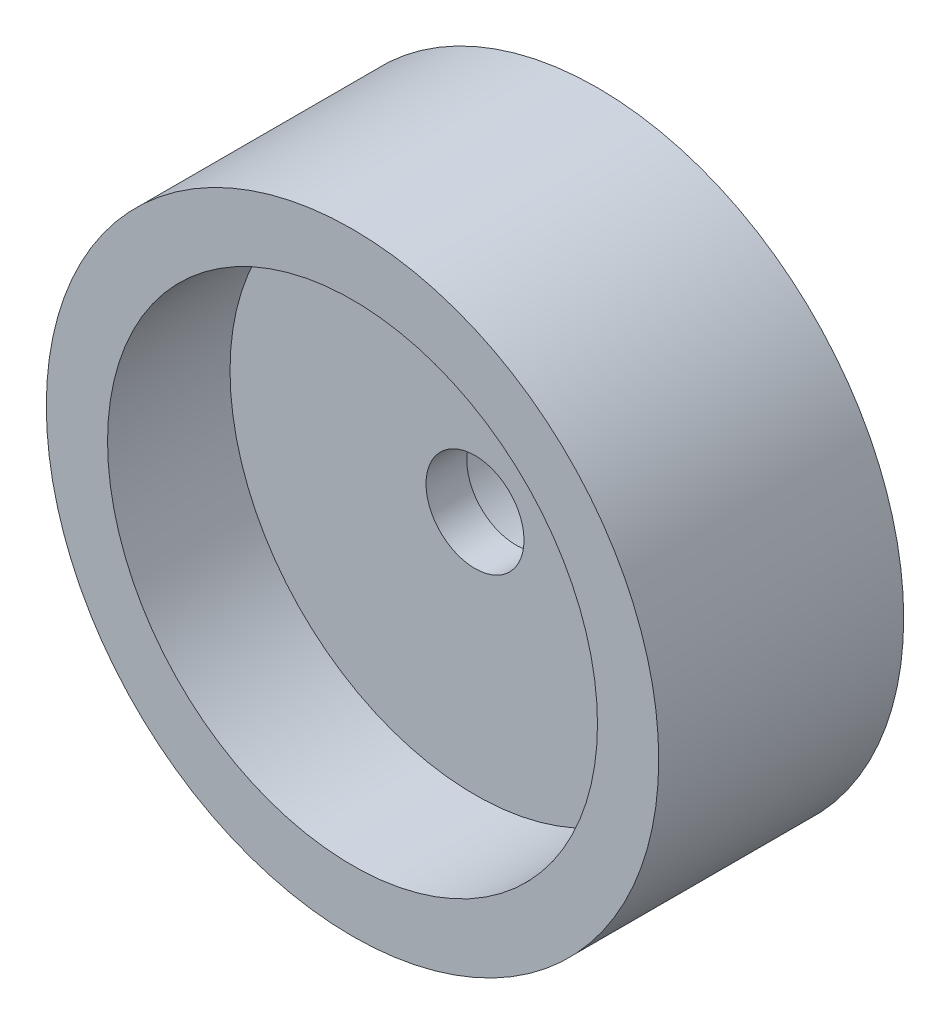
ISO-10303-21;
HEADER;
FILE_DESCRIPTION(('STEP AP214'),'2;1');
FILE_NAME('part.step','',(''),(''),'','','');
FILE_SCHEMA(('AUTOMOTIVE_DESIGN { 1 0 10303 214 1 1 1 1 }'));
ENDSEC;
DATA;
#1=APPLICATION_CONTEXT('core data for automotive mechanical design processes');
#2=APPLICATION_PROTOCOL_DEFINITION('international standard','automotive_design',2000,#1);
#3=PRODUCT_CONTEXT('',#1,'mechanical');
#4=PRODUCT('Part','Part','',(#3));
#5=PRODUCT_RELATED_PRODUCT_CATEGORY('part','',(#4));
#6=PRODUCT_DEFINITION_FORMATION('','',#4);
#7=PRODUCT_DEFINITION_CONTEXT('part definition',#1,'design');
#8=PRODUCT_DEFINITION('design','',#6,#7);
#9=PRODUCT_DEFINITION_SHAPE('','',#8);
#10=(LENGTH_UNIT() NAMED_UNIT(*) SI_UNIT(.MILLI.,.METRE.));
#11=(NAMED_UNIT(*) PLANE_ANGLE_UNIT() SI_UNIT($,.RADIAN.));
#12=(NAMED_UNIT(*) SI_UNIT($,.STERADIAN.) SOLID_ANGLE_UNIT());
#13=UNCERTAINTY_MEASURE_WITH_UNIT(LENGTH_MEASURE(1.E-05),#10,'distance_accuracy_value','');
#14=(GEOMETRIC_REPRESENTATION_CONTEXT(3) GLOBAL_UNCERTAINTY_ASSIGNED_CONTEXT((#13)) GLOBAL_UNIT_ASSIGNED_CONTEXT((#10,
#11,#12)) REPRESENTATION_CONTEXT('',''));
#15=CARTESIAN_POINT('',(0.,0.,0.));
#16=DIRECTION('',(0.,0.,1.));
#17=DIRECTION('',(1.,0.,0.));
#18=AXIS2_PLACEMENT_3D('',#15,#16,#17);
#19=CARTESIAN_POINT('',(0.,0.,6.));
#20=DIRECTION('',(0.,0.,-1.));
#21=DIRECTION('',(-1.,0.,0.));
#22=AXIS2_PLACEMENT_3D('',#19,#20,#21);
#23=CYLINDRICAL_SURFACE('',#22,7.5);
#24=CARTESIAN_POINT('',(0.,0.,6.));
#25=DIRECTION('',(0.,0.,1.));
#26=DIRECTION('',(1.,0.,0.));
#27=AXIS2_PLACEMENT_3D('',#24,#25,#26);
#28=CIRCLE('',#27,7.5);
#29=CARTESIAN_POINT('',(7.5,0.,6.));
#30=VERTEX_POINT('',#29);
#31=EDGE_CURVE('E10',#30,#30,#28,.T.);
#32=ORIENTED_EDGE('',*,*,#31,.F.);
#33=EDGE_LOOP('',(#32));
#34=FACE_BOUND('',#33,.T.);
#35=CARTESIAN_POINT('',(0.,0.,0.));
#36=DIRECTION('',(0.,0.,1.));
#37=DIRECTION('',(1.,0.,0.));
#38=AXIS2_PLACEMENT_3D('',#35,#36,#37);
#39=CIRCLE('',#38,7.5);
#40=CARTESIAN_POINT('',(7.5,0.,0.));
#41=VERTEX_POINT('',#40);
#42=EDGE_CURVE('E38',#41,#41,#39,.T.);
#43=ORIENTED_EDGE('',*,*,#42,.T.);
#44=EDGE_LOOP('',(#43));
#45=FACE_BOUND('',#44,.T.);
#46=ADVANCED_FACE('F31',(#34,#45),#23,.T.);
#47=CARTESIAN_POINT('',(0.,0.,6.));
#48=DIRECTION('',(0.,0.,1.));
#49=DIRECTION('',(1.,0.,0.));
#50=AXIS2_PLACEMENT_3D('',#47,#48,#49);
#51=PLANE('',#50);
#52=CARTESIAN_POINT('',(0.,0.,6.));
#53=DIRECTION('',(0.,0.,1.));
#54=DIRECTION('',(1.,0.,0.));
#55=AXIS2_PLACEMENT_3D('',#52,#53,#54);
#56=CIRCLE('',#55,6.);
#57=CARTESIAN_POINT('',(6.,0.,6.));
#58=VERTEX_POINT('',#57);
#59=EDGE_CURVE('E45',#58,#58,#56,.T.);
#60=ORIENTED_EDGE('',*,*,#59,.F.);
#61=EDGE_LOOP('',(#60));
#62=FACE_BOUND('',#61,.T.);
#63=ORIENTED_EDGE('',*,*,#31,.T.);
#64=EDGE_LOOP('',(#63));
#65=FACE_BOUND('',#64,.T.);
#66=ADVANCED_FACE('F69',(#62,#65),#51,.T.);
#67=CARTESIAN_POINT('',(0.,0.,0.));
#68=DIRECTION('',(0.,0.,1.));
#69=DIRECTION('',(1.,0.,0.));
#70=AXIS2_PLACEMENT_3D('',#67,#68,#69);
#71=PLANE('',#70);
#72=CARTESIAN_POINT('',(0.,0.,0.));
#73=DIRECTION('',(0.,0.,-1.));
#74=DIRECTION('',(-1.,0.,0.));
#75=AXIS2_PLACEMENT_3D('',#72,#73,#74);
#76=CIRCLE('',#75,2.275);
#77=CARTESIAN_POINT('',(-2.275,0.,0.));
#78=VERTEX_POINT('',#77);
#79=EDGE_CURVE('E59',#78,#78,#76,.T.);
#80=ORIENTED_EDGE('',*,*,#79,.F.);
#81=EDGE_LOOP('',(#80));
#82=FACE_BOUND('',#81,.T.);
#83=ORIENTED_EDGE('',*,*,#42,.F.);
#84=EDGE_LOOP('',(#83));
#85=FACE_BOUND('',#84,.T.);
#86=ADVANCED_FACE('F65',(#82,#85),#71,.F.);
#87=CARTESIAN_POINT('',(0.,0.,3.));
#88=DIRECTION('',(0.,0.,1.));
#89=DIRECTION('',(1.,0.,0.));
#90=AXIS2_PLACEMENT_3D('',#87,#88,#89);
#91=CYLINDRICAL_SURFACE('',#90,6.);
#92=CARTESIAN_POINT('',(0.,0.,3.));
#93=DIRECTION('',(0.,0.,1.));
#94=DIRECTION('',(1.,0.,0.));
#95=AXIS2_PLACEMENT_3D('',#92,#93,#94);
#96=CIRCLE('',#95,6.);
#97=CARTESIAN_POINT('',(6.,0.,3.));
#98=VERTEX_POINT('',#97);
#99=EDGE_CURVE('E43',#98,#98,#96,.T.);
#100=ORIENTED_EDGE('',*,*,#99,.F.);
#101=EDGE_LOOP('',(#100));
#102=FACE_BOUND('',#101,.T.);
#103=ORIENTED_EDGE('',*,*,#59,.T.);
#104=EDGE_LOOP('',(#103));
#105=FACE_BOUND('',#104,.T.);
#106=ADVANCED_FACE('F68',(#102,#105),#91,.F.);
#107=CARTESIAN_POINT('',(0.,0.,3.));
#108=DIRECTION('',(0.,0.,1.));
#109=DIRECTION('',(1.,0.,0.));
#110=AXIS2_PLACEMENT_3D('',#107,#108,#109);
#111=PLANE('',#110);
#112=CARTESIAN_POINT('',(0.,0.,3.));
#113=DIRECTION('',(0.,0.,1.));
#114=DIRECTION('',(1.,0.,0.));
#115=AXIS2_PLACEMENT_3D('',#112,#113,#114);
#116=CIRCLE('',#115,1.2);
#117=CARTESIAN_POINT('',(1.2,0.,3.));
#118=VERTEX_POINT('',#117);
#119=EDGE_CURVE('E34',#118,#118,#116,.T.);
#120=ORIENTED_EDGE('',*,*,#119,.F.);
#121=EDGE_LOOP('',(#120));
#122=FACE_BOUND('',#121,.T.);
#123=ORIENTED_EDGE('',*,*,#99,.T.);
#124=EDGE_LOOP('',(#123));
#125=FACE_BOUND('',#124,.T.);
#126=ADVANCED_FACE('F86',(#122,#125),#111,.T.);
#127=CARTESIAN_POINT('',(0.,0.,0.));
#128=DIRECTION('',(0.,0.,-1.));
#129=DIRECTION('',(-1.,0.,0.));
#130=AXIS2_PLACEMENT_3D('',#127,#128,#129);
#131=CYLINDRICAL_SURFACE('',#130,1.2);
#132=ORIENTED_EDGE('',*,*,#119,.T.);
#133=EDGE_LOOP('',(#132));
#134=FACE_BOUND('',#133,.T.);
#135=CARTESIAN_POINT('',(0.,0.,2.));
#136=DIRECTION('',(0.,0.,-1.));
#137=DIRECTION('',(-1.,0.,0.));
#138=AXIS2_PLACEMENT_3D('',#135,#136,#137);
#139=CIRCLE('',#138,1.2);
#140=CARTESIAN_POINT('',(-1.2,0.,2.));
#141=VERTEX_POINT('',#140);
#142=EDGE_CURVE('E50',#141,#141,#139,.T.);
#143=ORIENTED_EDGE('',*,*,#142,.T.);
#144=EDGE_LOOP('',(#143));
#145=FACE_BOUND('',#144,.T.);
#146=ADVANCED_FACE('F90',(#134,#145),#131,.F.);
#147=CARTESIAN_POINT('',(1.2,0.,2.));
#148=DIRECTION('',(0.,0.,1.));
#149=DIRECTION('',(1.,0.,0.));
#150=AXIS2_PLACEMENT_3D('',#147,#148,#149);
#151=PLANE('',#150);
#152=ORIENTED_EDGE('',*,*,#142,.F.);
#153=EDGE_LOOP('',(#152));
#154=FACE_BOUND('',#153,.T.);
#155=CARTESIAN_POINT('',(0.,0.,2.));
#156=DIRECTION('',(0.,0.,-1.));
#157=DIRECTION('',(-1.,0.,0.));
#158=AXIS2_PLACEMENT_3D('',#155,#156,#157);
#159=CIRCLE('',#158,2.25);
#160=CARTESIAN_POINT('',(-2.25,0.,2.));
#161=VERTEX_POINT('',#160);
#162=EDGE_CURVE('E53',#161,#161,#159,.T.);
#163=ORIENTED_EDGE('',*,*,#162,.T.);
#164=EDGE_LOOP('',(#163));
#165=FACE_BOUND('',#164,.T.);
#166=ADVANCED_FACE('F94',(#154,#165),#151,.F.);
#167=CARTESIAN_POINT('',(0.,0.,0.));
#168=DIRECTION('',(0.,0.,-1.));
#169=DIRECTION('',(-1.,0.,0.));
#170=AXIS2_PLACEMENT_3D('',#167,#168,#169);
#171=CYLINDRICAL_SURFACE('',#170,2.25);
#172=ORIENTED_EDGE('',*,*,#162,.F.);
#173=EDGE_LOOP('',(#172));
#174=FACE_BOUND('',#173,.T.);
#175=CARTESIAN_POINT('',(0.,0.,0.0249999999999985));
#176=DIRECTION('',(0.,0.,-1.));
#177=DIRECTION('',(-1.,0.,0.));
#178=AXIS2_PLACEMENT_3D('',#175,#176,#177);
#179=CIRCLE('',#178,2.25);
#180=CARTESIAN_POINT('',(-2.25,0.,0.0249999999999985));
#181=VERTEX_POINT('',#180);
#182=EDGE_CURVE('E56',#181,#181,#179,.T.);
#183=ORIENTED_EDGE('',*,*,#182,.T.);
#184=EDGE_LOOP('',(#183));
#185=FACE_BOUND('',#184,.T.);
#186=ADVANCED_FACE('F98',(#174,#185),#171,.F.);
#187=CARTESIAN_POINT('',(0.,0.,0.));
#188=DIRECTION('',(0.,0.,-1.));
#189=DIRECTION('',(-1.,0.,0.));
#190=AXIS2_PLACEMENT_3D('',#187,#188,#189);
#191=CONICAL_SURFACE('',#190,2.275,0.785398163397492);
#192=ORIENTED_EDGE('',*,*,#182,.F.);
#193=EDGE_LOOP('',(#192));
#194=FACE_BOUND('',#193,.T.);
#195=ORIENTED_EDGE('',*,*,#79,.T.);
#196=EDGE_LOOP('',(#195));
#197=FACE_BOUND('',#196,.T.);
#198=ADVANCED_FACE('F63',(#194,#197),#191,.F.);
#199=CLOSED_SHELL('',(#46,#66,#86,#106,#126,#146,#166,#186,#198));
#200=MANIFOLD_SOLID_BREP('B2',#199);
#201=ADVANCED_BREP_SHAPE_REPRESENTATION('',(#18,#200),#14);
#202=SHAPE_DEFINITION_REPRESENTATION(#9,#201);
ENDSEC;
END-ISO-10303-21;
